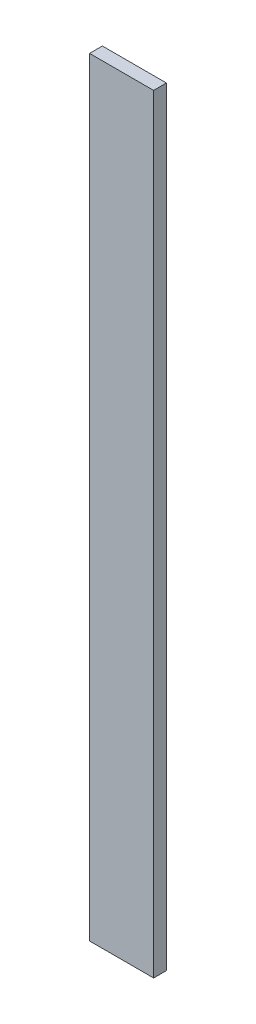
ISO-10303-21;
HEADER;
FILE_DESCRIPTION(('STEP AP214'),'2;1');
FILE_NAME('part.step','',(''),(''),'','','');
FILE_SCHEMA(('AUTOMOTIVE_DESIGN { 1 0 10303 214 1 1 1 1 }'));
ENDSEC;
DATA;
#1=APPLICATION_CONTEXT('core data for automotive mechanical design processes');
#2=APPLICATION_PROTOCOL_DEFINITION('international standard','automotive_design',2000,#1);
#3=PRODUCT_CONTEXT('',#1,'mechanical');
#4=PRODUCT('Part','Part','',(#3));
#5=PRODUCT_RELATED_PRODUCT_CATEGORY('part','',(#4));
#6=PRODUCT_DEFINITION_FORMATION('','',#4);
#7=PRODUCT_DEFINITION_CONTEXT('part definition',#1,'design');
#8=PRODUCT_DEFINITION('design','',#6,#7);
#9=PRODUCT_DEFINITION_SHAPE('','',#8);
#10=(LENGTH_UNIT() NAMED_UNIT(*) SI_UNIT(.MILLI.,.METRE.));
#11=(NAMED_UNIT(*) PLANE_ANGLE_UNIT() SI_UNIT($,.RADIAN.));
#12=(NAMED_UNIT(*) SI_UNIT($,.STERADIAN.) SOLID_ANGLE_UNIT());
#13=UNCERTAINTY_MEASURE_WITH_UNIT(LENGTH_MEASURE(1.E-05),#10,'distance_accuracy_value','');
#14=(GEOMETRIC_REPRESENTATION_CONTEXT(3) GLOBAL_UNCERTAINTY_ASSIGNED_CONTEXT((#13)) GLOBAL_UNIT_ASSIGNED_CONTEXT((#10,
#11,#12)) REPRESENTATION_CONTEXT('',''));
#15=CARTESIAN_POINT('',(0.,0.,0.));
#16=DIRECTION('',(0.,0.,1.));
#17=DIRECTION('',(1.,0.,0.));
#18=AXIS2_PLACEMENT_3D('',#15,#16,#17);
#19=CARTESIAN_POINT('',(145.,639.999999999999,12.));
#20=DIRECTION('',(1.,0.,0.));
#21=DIRECTION('',(0.,1.,0.));
#22=AXIS2_PLACEMENT_3D('',#19,#20,#21);
#23=PLANE('',#22);
#24=DIRECTION('',(0.,-1.,0.));
#25=VECTOR('',#24,1.);
#26=CARTESIAN_POINT('',(145.,639.999999999999,0.));
#27=LINE('',#26,#25);
#28=CARTESIAN_POINT('',(145.,639.999999999999,0.));
#29=VERTEX_POINT('',#28);
#30=CARTESIAN_POINT('',(145.,-79.9999999999999,0.));
#31=VERTEX_POINT('',#30);
#32=EDGE_CURVE('E100',#29,#31,#27,.T.);
#33=ORIENTED_EDGE('',*,*,#32,.T.);
#34=DIRECTION('',(0.,0.,-1.));
#35=VECTOR('',#34,1.);
#36=CARTESIAN_POINT('',(145.,-79.9999999999999,12.));
#37=LINE('',#36,#35);
#38=CARTESIAN_POINT('',(145.,-79.9999999999999,12.));
#39=VERTEX_POINT('',#38);
#40=EDGE_CURVE('E11',#39,#31,#37,.T.);
#41=ORIENTED_EDGE('',*,*,#40,.F.);
#42=DIRECTION('',(0.,-1.,0.));
#43=VECTOR('',#42,1.);
#44=CARTESIAN_POINT('',(145.,639.999999999999,12.));
#45=LINE('',#44,#43);
#46=CARTESIAN_POINT('',(145.,639.999999999999,12.));
#47=VERTEX_POINT('',#46);
#48=EDGE_CURVE('E88',#47,#39,#45,.T.);
#49=ORIENTED_EDGE('',*,*,#48,.F.);
#50=DIRECTION('',(0.,0.,-1.));
#51=VECTOR('',#50,1.);
#52=CARTESIAN_POINT('',(145.,639.999999999999,12.));
#53=LINE('',#52,#51);
#54=EDGE_CURVE('E96',#47,#29,#53,.T.);
#55=ORIENTED_EDGE('',*,*,#54,.T.);
#56=EDGE_LOOP('',(#33,#41,#49,#55));
#57=FACE_BOUND('',#56,.T.);
#58=ADVANCED_FACE('F37',(#57),#23,.F.);
#59=CARTESIAN_POINT('',(145.,-79.9999999999999,12.));
#60=DIRECTION('',(0.,1.,0.));
#61=DIRECTION('',(0.,0.,1.));
#62=AXIS2_PLACEMENT_3D('',#59,#60,#61);
#63=PLANE('',#62);
#64=DIRECTION('',(1.,0.,0.));
#65=VECTOR('',#64,1.);
#66=CARTESIAN_POINT('',(145.,-79.9999999999999,0.));
#67=LINE('',#66,#65);
#68=CARTESIAN_POINT('',(205.,-79.9999999999999,0.));
#69=VERTEX_POINT('',#68);
#70=EDGE_CURVE('E92',#31,#69,#67,.T.);
#71=ORIENTED_EDGE('',*,*,#70,.T.);
#72=DIRECTION('',(0.,0.,-1.));
#73=VECTOR('',#72,1.);
#74=CARTESIAN_POINT('',(205.,-79.9999999999999,12.));
#75=LINE('',#74,#73);
#76=CARTESIAN_POINT('',(205.,-79.9999999999999,12.));
#77=VERTEX_POINT('',#76);
#78=EDGE_CURVE('E45',#77,#69,#75,.T.);
#79=ORIENTED_EDGE('',*,*,#78,.F.);
#80=DIRECTION('',(1.,0.,0.));
#81=VECTOR('',#80,1.);
#82=CARTESIAN_POINT('',(145.,-79.9999999999999,12.));
#83=LINE('',#82,#81);
#84=EDGE_CURVE('E83',#39,#77,#83,.T.);
#85=ORIENTED_EDGE('',*,*,#84,.F.);
#86=ORIENTED_EDGE('',*,*,#40,.T.);
#87=EDGE_LOOP('',(#71,#79,#85,#86));
#88=FACE_BOUND('',#87,.T.);
#89=ADVANCED_FACE('F91',(#88),#63,.F.);
#90=CARTESIAN_POINT('',(205.,639.999999999999,12.));
#91=DIRECTION('',(-1.,0.,0.));
#92=DIRECTION('',(0.,-1.,0.));
#93=AXIS2_PLACEMENT_3D('',#90,#91,#92);
#94=PLANE('',#93);
#95=DIRECTION('',(0.,1.,0.));
#96=VECTOR('',#95,1.);
#97=CARTESIAN_POINT('',(205.,639.999999999999,0.));
#98=LINE('',#97,#96);
#99=CARTESIAN_POINT('',(205.,639.999999999999,0.));
#100=VERTEX_POINT('',#99);
#101=EDGE_CURVE('E70',#69,#100,#98,.T.);
#102=ORIENTED_EDGE('',*,*,#101,.T.);
#103=DIRECTION('',(0.,0.,-1.));
#104=VECTOR('',#103,1.);
#105=CARTESIAN_POINT('',(205.,639.999999999999,12.));
#106=LINE('',#105,#104);
#107=CARTESIAN_POINT('',(205.,639.999999999999,12.));
#108=VERTEX_POINT('',#107);
#109=EDGE_CURVE('E93',#108,#100,#106,.T.);
#110=ORIENTED_EDGE('',*,*,#109,.F.);
#111=DIRECTION('',(0.,1.,0.));
#112=VECTOR('',#111,1.);
#113=CARTESIAN_POINT('',(205.,639.999999999999,12.));
#114=LINE('',#113,#112);
#115=EDGE_CURVE('E86',#77,#108,#114,.T.);
#116=ORIENTED_EDGE('',*,*,#115,.F.);
#117=ORIENTED_EDGE('',*,*,#78,.T.);
#118=EDGE_LOOP('',(#102,#110,#116,#117));
#119=FACE_BOUND('',#118,.T.);
#120=ADVANCED_FACE('F94',(#119),#94,.F.);
#121=CARTESIAN_POINT('',(145.,639.999999999999,12.));
#122=DIRECTION('',(0.,-1.,0.));
#123=DIRECTION('',(0.,0.,-1.));
#124=AXIS2_PLACEMENT_3D('',#121,#122,#123);
#125=PLANE('',#124);
#126=DIRECTION('',(-1.,0.,0.));
#127=VECTOR('',#126,1.);
#128=CARTESIAN_POINT('',(145.,639.999999999999,0.));
#129=LINE('',#128,#127);
#130=EDGE_CURVE('E76',#100,#29,#129,.T.);
#131=ORIENTED_EDGE('',*,*,#130,.T.);
#132=ORIENTED_EDGE('',*,*,#54,.F.);
#133=DIRECTION('',(-1.,0.,0.));
#134=VECTOR('',#133,1.);
#135=CARTESIAN_POINT('',(145.,639.999999999999,12.));
#136=LINE('',#135,#134);
#137=EDGE_CURVE('E53',#108,#47,#136,.T.);
#138=ORIENTED_EDGE('',*,*,#137,.F.);
#139=ORIENTED_EDGE('',*,*,#109,.T.);
#140=EDGE_LOOP('',(#131,#132,#138,#139));
#141=FACE_BOUND('',#140,.T.);
#142=ADVANCED_FACE('F107',(#141),#125,.F.);
#143=CARTESIAN_POINT('',(145.,-79.9999999999999,12.));
#144=DIRECTION('',(0.,0.,1.));
#145=DIRECTION('',(1.,0.,0.));
#146=AXIS2_PLACEMENT_3D('',#143,#144,#145);
#147=PLANE('',#146);
#148=ORIENTED_EDGE('',*,*,#48,.T.);
#149=ORIENTED_EDGE('',*,*,#84,.T.);
#150=ORIENTED_EDGE('',*,*,#115,.T.);
#151=ORIENTED_EDGE('',*,*,#137,.T.);
#152=EDGE_LOOP('',(#148,#149,#150,#151));
#153=FACE_BOUND('',#152,.T.);
#154=ADVANCED_FACE('F84',(#153),#147,.T.);
#155=CARTESIAN_POINT('',(145.,-79.9999999999999,0.));
#156=DIRECTION('',(0.,0.,1.));
#157=DIRECTION('',(1.,0.,0.));
#158=AXIS2_PLACEMENT_3D('',#155,#156,#157);
#159=PLANE('',#158);
#160=ORIENTED_EDGE('',*,*,#32,.F.);
#161=ORIENTED_EDGE('',*,*,#130,.F.);
#162=ORIENTED_EDGE('',*,*,#101,.F.);
#163=ORIENTED_EDGE('',*,*,#70,.F.);
#164=EDGE_LOOP('',(#160,#161,#162,#163));
#165=FACE_BOUND('',#164,.T.);
#166=ADVANCED_FACE('F110',(#165),#159,.F.);
#167=CLOSED_SHELL('',(#58,#89,#120,#142,#154,#166));
#168=MANIFOLD_SOLID_BREP('B2',#167);
#169=ADVANCED_BREP_SHAPE_REPRESENTATION('',(#18,#168),#14);
#170=SHAPE_DEFINITION_REPRESENTATION(#9,#169);
ENDSEC;
END-ISO-10303-21;
